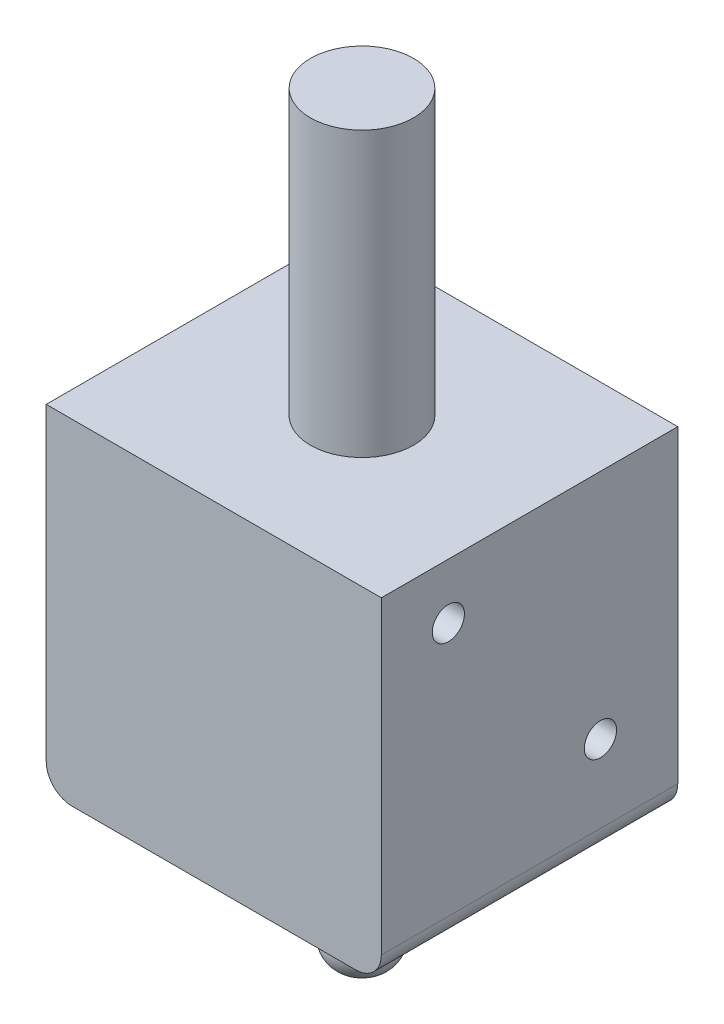
ISO-10303-21;
HEADER;
FILE_DESCRIPTION(('STEP AP214'),'2;1');
FILE_NAME('part.step','',(''),(''),'','','');
FILE_SCHEMA(('AUTOMOTIVE_DESIGN { 1 0 10303 214 1 1 1 1 }'));
ENDSEC;
DATA;
#1=APPLICATION_CONTEXT('core data for automotive mechanical design processes');
#2=APPLICATION_PROTOCOL_DEFINITION('international standard','automotive_design',2000,#1);
#3=PRODUCT_CONTEXT('',#1,'mechanical');
#4=PRODUCT('Part','Part','',(#3));
#5=PRODUCT_RELATED_PRODUCT_CATEGORY('part','',(#4));
#6=PRODUCT_DEFINITION_FORMATION('','',#4);
#7=PRODUCT_DEFINITION_CONTEXT('part definition',#1,'design');
#8=PRODUCT_DEFINITION('design','',#6,#7);
#9=PRODUCT_DEFINITION_SHAPE('','',#8);
#10=(LENGTH_UNIT() NAMED_UNIT(*) SI_UNIT(.MILLI.,.METRE.));
#11=(NAMED_UNIT(*) PLANE_ANGLE_UNIT() SI_UNIT($,.RADIAN.));
#12=(NAMED_UNIT(*) SI_UNIT($,.STERADIAN.) SOLID_ANGLE_UNIT());
#13=UNCERTAINTY_MEASURE_WITH_UNIT(LENGTH_MEASURE(1.E-05),#10,'distance_accuracy_value','');
#14=(GEOMETRIC_REPRESENTATION_CONTEXT(3) GLOBAL_UNCERTAINTY_ASSIGNED_CONTEXT((#13)) GLOBAL_UNIT_ASSIGNED_CONTEXT((#10,
#11,#12)) REPRESENTATION_CONTEXT('',''));
#15=CARTESIAN_POINT('',(0.,0.,0.));
#16=DIRECTION('',(0.,0.,1.));
#17=DIRECTION('',(1.,0.,0.));
#18=AXIS2_PLACEMENT_3D('',#15,#16,#17);
#19=CARTESIAN_POINT('',(13.,26.,11.5));
#20=DIRECTION('',(-1.,0.,0.));
#21=DIRECTION('',(0.,0.,1.));
#22=AXIS2_PLACEMENT_3D('',#19,#20,#21);
#23=PLANE('',#22);
#24=CARTESIAN_POINT('',(13.,21.7,6.29999999999999));
#25=DIRECTION('',(1.,0.,0.));
#26=DIRECTION('',(0.,0.,-1.));
#27=AXIS2_PLACEMENT_3D('',#24,#25,#26);
#28=CIRCLE('',#27,1.24999999999999);
#29=CARTESIAN_POINT('',(13.,21.7,5.05000000000001));
#30=VERTEX_POINT('',#29);
#31=EDGE_CURVE('E118',#30,#30,#28,.T.);
#32=ORIENTED_EDGE('',*,*,#31,.F.);
#33=EDGE_LOOP('',(#32));
#34=FACE_BOUND('',#33,.T.);
#35=CARTESIAN_POINT('',(13.,8.,-5.5));
#36=DIRECTION('',(1.,0.,0.));
#37=DIRECTION('',(0.,0.,-1.));
#38=AXIS2_PLACEMENT_3D('',#35,#36,#37);
#39=CIRCLE('',#38,1.24999999999999);
#40=CARTESIAN_POINT('',(13.,8.,-6.74999999999999));
#41=VERTEX_POINT('',#40);
#42=EDGE_CURVE('E117',#41,#41,#39,.T.);
#43=ORIENTED_EDGE('',*,*,#42,.F.);
#44=EDGE_LOOP('',(#43));
#45=FACE_BOUND('',#44,.T.);
#46=DIRECTION('',(0.,-1.,0.));
#47=VECTOR('',#46,1.);
#48=CARTESIAN_POINT('',(13.,26.,11.5));
#49=LINE('',#48,#47);
#50=CARTESIAN_POINT('',(13.,26.,11.5));
#51=VERTEX_POINT('',#50);
#52=CARTESIAN_POINT('',(13.,2.00000000000001,11.5));
#53=VERTEX_POINT('',#52);
#54=EDGE_CURVE('E141',#51,#53,#49,.T.);
#55=ORIENTED_EDGE('',*,*,#54,.T.);
#56=DIRECTION('',(0.,0.,-1.));
#57=VECTOR('',#56,1.);
#58=CARTESIAN_POINT('',(13.,2.,-11.5));
#59=LINE('',#58,#57);
#60=CARTESIAN_POINT('',(13.,2.00000000000001,-11.5));
#61=VERTEX_POINT('',#60);
#62=EDGE_CURVE('E169',#53,#61,#59,.T.);
#63=ORIENTED_EDGE('',*,*,#62,.T.);
#64=DIRECTION('',(0.,-1.,0.));
#65=VECTOR('',#64,1.);
#66=CARTESIAN_POINT('',(13.,26.,-11.5));
#67=LINE('',#66,#65);
#68=CARTESIAN_POINT('',(13.,26.,-11.5));
#69=VERTEX_POINT('',#68);
#70=EDGE_CURVE('E153',#69,#61,#67,.T.);
#71=ORIENTED_EDGE('',*,*,#70,.F.);
#72=DIRECTION('',(0.,0.,-1.));
#73=VECTOR('',#72,1.);
#74=CARTESIAN_POINT('',(13.,26.,11.5));
#75=LINE('',#74,#73);
#76=EDGE_CURVE('E131',#51,#69,#75,.T.);
#77=ORIENTED_EDGE('',*,*,#76,.F.);
#78=EDGE_LOOP('',(#55,#63,#71,#77));
#79=FACE_BOUND('',#78,.T.);
#80=ADVANCED_FACE('F47',(#34,#45,#79),#23,.F.);
#81=CARTESIAN_POINT('',(-13.,26.,-11.5));
#82=DIRECTION('',(0.,0.,1.));
#83=DIRECTION('',(1.,0.,0.));
#84=AXIS2_PLACEMENT_3D('',#81,#82,#83);
#85=PLANE('',#84);
#86=DIRECTION('',(-1.,0.,0.));
#87=VECTOR('',#86,1.);
#88=CARTESIAN_POINT('',(-13.,0.,-11.5));
#89=LINE('',#88,#87);
#90=CARTESIAN_POINT('',(11.,0.,-11.5));
#91=VERTEX_POINT('',#90);
#92=CARTESIAN_POINT('',(-11.,0.,-11.5));
#93=VERTEX_POINT('',#92);
#94=EDGE_CURVE('E130',#91,#93,#89,.T.);
#95=ORIENTED_EDGE('',*,*,#94,.T.);
#96=CARTESIAN_POINT('',(-11.,2.,-11.5));
#97=DIRECTION('',(0.,0.,1.));
#98=DIRECTION('',(1.,0.,0.));
#99=AXIS2_PLACEMENT_3D('',#96,#97,#98);
#100=CIRCLE('',#99,2.);
#101=CARTESIAN_POINT('',(-13.,2.00000000000001,-11.5));
#102=VERTEX_POINT('',#101);
#103=EDGE_CURVE('E167',#93,#102,#100,.F.);
#104=ORIENTED_EDGE('',*,*,#103,.T.);
#105=DIRECTION('',(0.,-1.,0.));
#106=VECTOR('',#105,1.);
#107=CARTESIAN_POINT('',(-13.,26.,-11.5));
#108=LINE('',#107,#106);
#109=CARTESIAN_POINT('',(-13.,26.,-11.5));
#110=VERTEX_POINT('',#109);
#111=EDGE_CURVE('E150',#110,#102,#108,.T.);
#112=ORIENTED_EDGE('',*,*,#111,.F.);
#113=DIRECTION('',(-1.,0.,0.));
#114=VECTOR('',#113,1.);
#115=CARTESIAN_POINT('',(-13.,26.,-11.5));
#116=LINE('',#115,#114);
#117=EDGE_CURVE('E134',#69,#110,#116,.T.);
#118=ORIENTED_EDGE('',*,*,#117,.F.);
#119=ORIENTED_EDGE('',*,*,#70,.T.);
#120=CARTESIAN_POINT('',(11.,2.,-11.5));
#121=DIRECTION('',(0.,0.,1.));
#122=DIRECTION('',(1.,0.,0.));
#123=AXIS2_PLACEMENT_3D('',#120,#121,#122);
#124=CIRCLE('',#123,2.);
#125=EDGE_CURVE('E62',#61,#91,#124,.F.);
#126=ORIENTED_EDGE('',*,*,#125,.T.);
#127=EDGE_LOOP('',(#95,#104,#112,#118,#119,#126));
#128=FACE_BOUND('',#127,.T.);
#129=ADVANCED_FACE('F199',(#128),#85,.F.);
#130=CARTESIAN_POINT('',(-13.,26.,11.5));
#131=DIRECTION('',(1.,0.,0.));
#132=DIRECTION('',(0.,0.,-1.));
#133=AXIS2_PLACEMENT_3D('',#130,#131,#132);
#134=PLANE('',#133);
#135=ORIENTED_EDGE('',*,*,#111,.T.);
#136=DIRECTION('',(0.,0.,1.));
#137=VECTOR('',#136,1.);
#138=CARTESIAN_POINT('',(-13.,2.,11.5));
#139=LINE('',#138,#137);
#140=CARTESIAN_POINT('',(-13.,2.00000000000001,11.5));
#141=VERTEX_POINT('',#140);
#142=EDGE_CURVE('E156',#102,#141,#139,.T.);
#143=ORIENTED_EDGE('',*,*,#142,.T.);
#144=DIRECTION('',(0.,-1.,0.));
#145=VECTOR('',#144,1.);
#146=CARTESIAN_POINT('',(-13.,26.,11.5));
#147=LINE('',#146,#145);
#148=CARTESIAN_POINT('',(-13.,26.,11.5));
#149=VERTEX_POINT('',#148);
#150=EDGE_CURVE('E147',#149,#141,#147,.T.);
#151=ORIENTED_EDGE('',*,*,#150,.F.);
#152=DIRECTION('',(0.,0.,1.));
#153=VECTOR('',#152,1.);
#154=CARTESIAN_POINT('',(-13.,26.,11.5));
#155=LINE('',#154,#153);
#156=EDGE_CURVE('E137',#110,#149,#155,.T.);
#157=ORIENTED_EDGE('',*,*,#156,.F.);
#158=EDGE_LOOP('',(#135,#143,#151,#157));
#159=FACE_BOUND('',#158,.T.);
#160=ADVANCED_FACE('F202',(#159),#134,.F.);
#161=CARTESIAN_POINT('',(-13.,26.,11.5));
#162=DIRECTION('',(0.,0.,-1.));
#163=DIRECTION('',(-1.,0.,0.));
#164=AXIS2_PLACEMENT_3D('',#161,#162,#163);
#165=PLANE('',#164);
#166=ORIENTED_EDGE('',*,*,#150,.T.);
#167=CARTESIAN_POINT('',(-11.,2.,11.5));
#168=DIRECTION('',(0.,0.,-1.));
#169=DIRECTION('',(-1.,0.,0.));
#170=AXIS2_PLACEMENT_3D('',#167,#168,#169);
#171=CIRCLE('',#170,2.);
#172=CARTESIAN_POINT('',(-11.,0.,11.5));
#173=VERTEX_POINT('',#172);
#174=EDGE_CURVE('E161',#141,#173,#171,.F.);
#175=ORIENTED_EDGE('',*,*,#174,.T.);
#176=DIRECTION('',(1.,0.,0.));
#177=VECTOR('',#176,1.);
#178=CARTESIAN_POINT('',(-13.,0.,11.5));
#179=LINE('',#178,#177);
#180=CARTESIAN_POINT('',(11.,0.,11.5));
#181=VERTEX_POINT('',#180);
#182=EDGE_CURVE('E135',#173,#181,#179,.T.);
#183=ORIENTED_EDGE('',*,*,#182,.T.);
#184=CARTESIAN_POINT('',(11.,2.,11.5));
#185=DIRECTION('',(0.,0.,-1.));
#186=DIRECTION('',(-1.,0.,0.));
#187=AXIS2_PLACEMENT_3D('',#184,#185,#186);
#188=CIRCLE('',#187,2.);
#189=EDGE_CURVE('E159',#181,#53,#188,.F.);
#190=ORIENTED_EDGE('',*,*,#189,.T.);
#191=ORIENTED_EDGE('',*,*,#54,.F.);
#192=DIRECTION('',(1.,0.,0.));
#193=VECTOR('',#192,1.);
#194=CARTESIAN_POINT('',(-13.,26.,11.5));
#195=LINE('',#194,#193);
#196=EDGE_CURVE('E139',#149,#51,#195,.T.);
#197=ORIENTED_EDGE('',*,*,#196,.F.);
#198=EDGE_LOOP('',(#166,#175,#183,#190,#191,#197));
#199=FACE_BOUND('',#198,.T.);
#200=ADVANCED_FACE('F211',(#199),#165,.F.);
#201=CARTESIAN_POINT('',(0.,26.,0.));
#202=DIRECTION('',(0.,-1.,0.));
#203=DIRECTION('',(0.,0.,-1.));
#204=AXIS2_PLACEMENT_3D('',#201,#202,#203);
#205=PLANE('',#204);
#206=CARTESIAN_POINT('',(0.,26.,0.));
#207=DIRECTION('',(0.,1.,0.));
#208=DIRECTION('',(0.,0.,1.));
#209=AXIS2_PLACEMENT_3D('',#206,#207,#208);
#210=CIRCLE('',#209,4.);
#211=CARTESIAN_POINT('',(0.,26.,4.));
#212=VERTEX_POINT('',#211);
#213=EDGE_CURVE('E170',#212,#212,#210,.T.);
#214=ORIENTED_EDGE('',*,*,#213,.F.);
#215=EDGE_LOOP('',(#214));
#216=FACE_BOUND('',#215,.T.);
#217=ORIENTED_EDGE('',*,*,#76,.T.);
#218=ORIENTED_EDGE('',*,*,#117,.T.);
#219=ORIENTED_EDGE('',*,*,#156,.T.);
#220=ORIENTED_EDGE('',*,*,#196,.T.);
#221=EDGE_LOOP('',(#217,#218,#219,#220));
#222=FACE_BOUND('',#221,.T.);
#223=ADVANCED_FACE('F189',(#216,#222),#205,.F.);
#224=CARTESIAN_POINT('',(0.,0.,0.));
#225=DIRECTION('',(0.,-1.,0.));
#226=DIRECTION('',(0.,0.,-1.));
#227=AXIS2_PLACEMENT_3D('',#224,#225,#226);
#228=PLANE('',#227);
#229=CARTESIAN_POINT('',(0.,0.,0.));
#230=DIRECTION('',(0.,-1.,0.));
#231=DIRECTION('',(0.,0.,-1.));
#232=AXIS2_PLACEMENT_3D('',#229,#230,#231);
#233=CIRCLE('',#232,2.5);
#234=CARTESIAN_POINT('',(0.,0.,-2.5));
#235=VERTEX_POINT('',#234);
#236=EDGE_CURVE('E180',#235,#235,#233,.T.);
#237=ORIENTED_EDGE('',*,*,#236,.F.);
#238=EDGE_LOOP('',(#237));
#239=FACE_BOUND('',#238,.T.);
#240=ORIENTED_EDGE('',*,*,#182,.F.);
#241=DIRECTION('',(0.,0.,1.));
#242=VECTOR('',#241,1.);
#243=CARTESIAN_POINT('',(-11.,0.,-11.5));
#244=LINE('',#243,#242);
#245=EDGE_CURVE('E70',#173,#93,#244,.F.);
#246=ORIENTED_EDGE('',*,*,#245,.T.);
#247=ORIENTED_EDGE('',*,*,#94,.F.);
#248=DIRECTION('',(0.,0.,-1.));
#249=VECTOR('',#248,1.);
#250=CARTESIAN_POINT('',(11.,0.,11.5));
#251=LINE('',#250,#249);
#252=EDGE_CURVE('E163',#91,#181,#251,.F.);
#253=ORIENTED_EDGE('',*,*,#252,.T.);
#254=EDGE_LOOP('',(#240,#246,#247,#253));
#255=FACE_BOUND('',#254,.T.);
#256=ADVANCED_FACE('F186',(#239,#255),#228,.T.);
#257=CARTESIAN_POINT('',(2.9,8.,-5.5));
#258=DIRECTION('',(1.,0.,0.));
#259=DIRECTION('',(0.,0.,-1.));
#260=AXIS2_PLACEMENT_3D('',#257,#258,#259);
#261=CONICAL_SURFACE('',#260,1.24999999999999,1.02974425867665);
#262=CARTESIAN_POINT('',(2.14892422621556,8.,-5.5));
#263=VERTEX_POINT('',#262);
#264=VERTEX_LOOP('',#263);
#265=FACE_BOUND('',#264,.T.);
#266=CARTESIAN_POINT('',(2.9,8.,-5.5));
#267=DIRECTION('',(1.,0.,0.));
#268=DIRECTION('',(0.,0.,-1.));
#269=AXIS2_PLACEMENT_3D('',#266,#267,#268);
#270=CIRCLE('',#269,1.24999999999999);
#271=CARTESIAN_POINT('',(2.9,8.,-6.74999999999999));
#272=VERTEX_POINT('',#271);
#273=EDGE_CURVE('E121',#272,#272,#270,.T.);
#274=ORIENTED_EDGE('',*,*,#273,.T.);
#275=EDGE_LOOP('',(#274));
#276=FACE_BOUND('',#275,.T.);
#277=ADVANCED_FACE('F188',(#265,#276),#261,.F.);
#278=CARTESIAN_POINT('',(13.,8.,-5.5));
#279=DIRECTION('',(1.,0.,0.));
#280=DIRECTION('',(0.,0.,-1.));
#281=AXIS2_PLACEMENT_3D('',#278,#279,#280);
#282=CYLINDRICAL_SURFACE('',#281,1.24999999999999);
#283=ORIENTED_EDGE('',*,*,#273,.F.);
#284=EDGE_LOOP('',(#283));
#285=FACE_BOUND('',#284,.T.);
#286=ORIENTED_EDGE('',*,*,#42,.T.);
#287=EDGE_LOOP('',(#286));
#288=FACE_BOUND('',#287,.T.);
#289=ADVANCED_FACE('F111',(#285,#288),#282,.F.);
#290=CARTESIAN_POINT('',(2.9,21.7,6.29999999999999));
#291=DIRECTION('',(1.,0.,0.));
#292=DIRECTION('',(0.,0.,-1.));
#293=AXIS2_PLACEMENT_3D('',#290,#291,#292);
#294=CONICAL_SURFACE('',#293,1.24999999999999,1.02974425867665);
#295=CARTESIAN_POINT('',(2.14892422621556,21.7,6.29999999999999));
#296=VERTEX_POINT('',#295);
#297=VERTEX_LOOP('',#296);
#298=FACE_BOUND('',#297,.T.);
#299=CARTESIAN_POINT('',(2.9,21.7,6.29999999999999));
#300=DIRECTION('',(1.,0.,0.));
#301=DIRECTION('',(0.,0.,-1.));
#302=AXIS2_PLACEMENT_3D('',#299,#300,#301);
#303=CIRCLE('',#302,1.24999999999999);
#304=CARTESIAN_POINT('',(2.9,21.7,5.05000000000001));
#305=VERTEX_POINT('',#304);
#306=EDGE_CURVE('E115',#305,#305,#303,.T.);
#307=ORIENTED_EDGE('',*,*,#306,.T.);
#308=EDGE_LOOP('',(#307));
#309=FACE_BOUND('',#308,.T.);
#310=ADVANCED_FACE('F107',(#298,#309),#294,.F.);
#311=CARTESIAN_POINT('',(13.,21.7,6.29999999999999));
#312=DIRECTION('',(1.,0.,0.));
#313=DIRECTION('',(0.,0.,-1.));
#314=AXIS2_PLACEMENT_3D('',#311,#312,#313);
#315=CYLINDRICAL_SURFACE('',#314,1.24999999999999);
#316=ORIENTED_EDGE('',*,*,#306,.F.);
#317=EDGE_LOOP('',(#316));
#318=FACE_BOUND('',#317,.T.);
#319=ORIENTED_EDGE('',*,*,#31,.T.);
#320=EDGE_LOOP('',(#319));
#321=FACE_BOUND('',#320,.T.);
#322=ADVANCED_FACE('F110',(#318,#321),#315,.F.);
#323=CARTESIAN_POINT('',(-11.,2.,11.5));
#324=DIRECTION('',(0.,0.,-1.));
#325=DIRECTION('',(-1.,0.,0.));
#326=AXIS2_PLACEMENT_3D('',#323,#324,#325);
#327=CYLINDRICAL_SURFACE('',#326,2.);
#328=ORIENTED_EDGE('',*,*,#103,.F.);
#329=ORIENTED_EDGE('',*,*,#245,.F.);
#330=ORIENTED_EDGE('',*,*,#174,.F.);
#331=ORIENTED_EDGE('',*,*,#142,.F.);
#332=EDGE_LOOP('',(#328,#329,#330,#331));
#333=FACE_BOUND('',#332,.T.);
#334=ADVANCED_FACE('F195',(#333),#327,.T.);
#335=CARTESIAN_POINT('',(11.,2.,11.5));
#336=DIRECTION('',(0.,0.,1.));
#337=DIRECTION('',(1.,0.,0.));
#338=AXIS2_PLACEMENT_3D('',#335,#336,#337);
#339=CYLINDRICAL_SURFACE('',#338,2.);
#340=ORIENTED_EDGE('',*,*,#189,.F.);
#341=ORIENTED_EDGE('',*,*,#252,.F.);
#342=ORIENTED_EDGE('',*,*,#125,.F.);
#343=ORIENTED_EDGE('',*,*,#62,.F.);
#344=EDGE_LOOP('',(#340,#341,#342,#343));
#345=FACE_BOUND('',#344,.T.);
#346=ADVANCED_FACE('F210',(#345),#339,.T.);
#347=CARTESIAN_POINT('',(0.,48.,0.));
#348=DIRECTION('',(0.,-1.,0.));
#349=DIRECTION('',(0.,0.,-1.));
#350=AXIS2_PLACEMENT_3D('',#347,#348,#349);
#351=CYLINDRICAL_SURFACE('',#350,4.);
#352=CARTESIAN_POINT('',(0.,48.,0.));
#353=DIRECTION('',(0.,1.,0.));
#354=DIRECTION('',(0.,0.,1.));
#355=AXIS2_PLACEMENT_3D('',#352,#353,#354);
#356=CIRCLE('',#355,4.);
#357=CARTESIAN_POINT('',(0.,48.,4.));
#358=VERTEX_POINT('',#357);
#359=EDGE_CURVE('E124',#358,#358,#356,.T.);
#360=ORIENTED_EDGE('',*,*,#359,.F.);
#361=EDGE_LOOP('',(#360));
#362=FACE_BOUND('',#361,.T.);
#363=ORIENTED_EDGE('',*,*,#213,.T.);
#364=EDGE_LOOP('',(#363));
#365=FACE_BOUND('',#364,.T.);
#366=ADVANCED_FACE('F234',(#362,#365),#351,.T.);
#367=CARTESIAN_POINT('',(0.,48.,0.));
#368=DIRECTION('',(0.,1.,0.));
#369=DIRECTION('',(0.,0.,1.));
#370=AXIS2_PLACEMENT_3D('',#367,#368,#369);
#371=PLANE('',#370);
#372=ORIENTED_EDGE('',*,*,#359,.T.);
#373=EDGE_LOOP('',(#372));
#374=FACE_BOUND('',#373,.T.);
#375=ADVANCED_FACE('F238',(#374),#371,.T.);
#376=CARTESIAN_POINT('',(0.,-11.,0.));
#377=DIRECTION('',(0.,1.,0.));
#378=DIRECTION('',(0.,0.,1.));
#379=AXIS2_PLACEMENT_3D('',#376,#377,#378);
#380=CYLINDRICAL_SURFACE('',#379,2.5);
#381=CARTESIAN_POINT('',(0.,-9.,0.));
#382=DIRECTION('',(0.,-1.,0.));
#383=DIRECTION('',(0.,0.,-1.));
#384=AXIS2_PLACEMENT_3D('',#381,#382,#383);
#385=CIRCLE('',#384,2.5);
#386=CARTESIAN_POINT('',(0.,-9.,-2.5));
#387=VERTEX_POINT('',#386);
#388=EDGE_CURVE('E11',#387,#387,#385,.F.);
#389=ORIENTED_EDGE('',*,*,#388,.T.);
#390=EDGE_LOOP('',(#389));
#391=FACE_BOUND('',#390,.T.);
#392=ORIENTED_EDGE('',*,*,#236,.T.);
#393=EDGE_LOOP('',(#392));
#394=FACE_BOUND('',#393,.T.);
#395=ADVANCED_FACE('F184',(#391,#394),#380,.T.);
#396=CARTESIAN_POINT('',(0.,-11.,0.));
#397=DIRECTION('',(0.,-1.,0.));
#398=DIRECTION('',(0.,0.,-1.));
#399=AXIS2_PLACEMENT_3D('',#396,#397,#398);
#400=PLANE('',#399);
#401=CARTESIAN_POINT('',(0.,-11.,0.));
#402=DIRECTION('',(0.,-1.,0.));
#403=DIRECTION('',(0.,0.,-1.));
#404=AXIS2_PLACEMENT_3D('',#401,#402,#403);
#405=CIRCLE('',#404,0.5);
#406=CARTESIAN_POINT('',(0.,-11.,-0.5));
#407=VERTEX_POINT('',#406);
#408=EDGE_CURVE('E55',#407,#407,#405,.T.);
#409=ORIENTED_EDGE('',*,*,#408,.T.);
#410=EDGE_LOOP('',(#409));
#411=FACE_BOUND('',#410,.T.);
#412=ADVANCED_FACE('F338',(#411),#400,.T.);
#413=CARTESIAN_POINT('',(0.,-9.,0.));
#414=DIRECTION('',(0.,-1.,0.));
#415=DIRECTION('',(0.,0.,-1.));
#416=AXIS2_PLACEMENT_3D('',#413,#414,#415);
#417=DEGENERATE_TOROIDAL_SURFACE('',#416,0.5,2.,.T.);
#418=ORIENTED_EDGE('',*,*,#388,.F.);
#419=EDGE_LOOP('',(#418));
#420=FACE_BOUND('',#419,.T.);
#421=ORIENTED_EDGE('',*,*,#408,.F.);
#422=EDGE_LOOP('',(#421));
#423=FACE_BOUND('',#422,.T.);
#424=ADVANCED_FACE('F49',(#420,#423),#417,.T.);
#425=CLOSED_SHELL('',(#80,#129,#160,#200,#223,#256,#277,#289,#310,#322,#334,#346,#366,#375,#395,
#412,#424));
#426=MANIFOLD_SOLID_BREP('B2',#425);
#427=ADVANCED_BREP_SHAPE_REPRESENTATION('',(#18,#426),#14);
#428=SHAPE_DEFINITION_REPRESENTATION(#9,#427);
ENDSEC;
END-ISO-10303-21;
